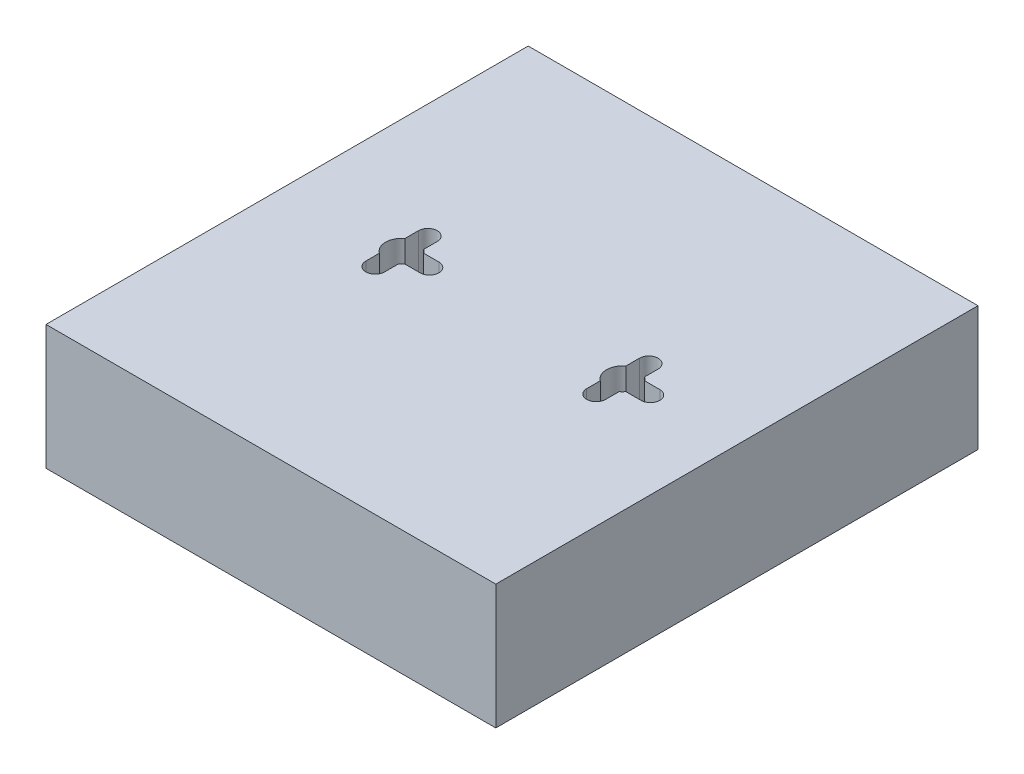
ISO-10303-21;
HEADER;
FILE_DESCRIPTION(('STEP AP214'),'2;1');
FILE_NAME('part.step','',(''),(''),'','','');
FILE_SCHEMA(('AUTOMOTIVE_DESIGN { 1 0 10303 214 1 1 1 1 }'));
ENDSEC;
DATA;
#1=APPLICATION_CONTEXT('core data for automotive mechanical design processes');
#2=APPLICATION_PROTOCOL_DEFINITION('international standard','automotive_design',2000,#1);
#3=PRODUCT_CONTEXT('',#1,'mechanical');
#4=PRODUCT('Part','Part','',(#3));
#5=PRODUCT_RELATED_PRODUCT_CATEGORY('part','',(#4));
#6=PRODUCT_DEFINITION_FORMATION('','',#4);
#7=PRODUCT_DEFINITION_CONTEXT('part definition',#1,'design');
#8=PRODUCT_DEFINITION('design','',#6,#7);
#9=PRODUCT_DEFINITION_SHAPE('','',#8);
#10=(LENGTH_UNIT() NAMED_UNIT(*) SI_UNIT(.MILLI.,.METRE.));
#11=(NAMED_UNIT(*) PLANE_ANGLE_UNIT() SI_UNIT($,.RADIAN.));
#12=(NAMED_UNIT(*) SI_UNIT($,.STERADIAN.) SOLID_ANGLE_UNIT());
#13=UNCERTAINTY_MEASURE_WITH_UNIT(LENGTH_MEASURE(1.E-05),#10,'distance_accuracy_value','');
#14=(GEOMETRIC_REPRESENTATION_CONTEXT(3) GLOBAL_UNCERTAINTY_ASSIGNED_CONTEXT((#13)) GLOBAL_UNIT_ASSIGNED_CONTEXT((#10,
#11,#12)) REPRESENTATION_CONTEXT('',''));
#15=CARTESIAN_POINT('',(0.,0.,0.));
#16=DIRECTION('',(0.,0.,1.));
#17=DIRECTION('',(1.,0.,0.));
#18=AXIS2_PLACEMENT_3D('',#15,#16,#17);
#19=CARTESIAN_POINT('',(0.,26.1,0.));
#20=DIRECTION('',(0.,0.,-1.));
#21=DIRECTION('',(-1.,0.,0.));
#22=AXIS2_PLACEMENT_3D('',#19,#20,#21);
#23=PLANE('',#22);
#24=DIRECTION('',(1.,0.,0.));
#25=VECTOR('',#24,1.);
#26=CARTESIAN_POINT('',(0.,0.,0.));
#27=LINE('',#26,#25);
#28=CARTESIAN_POINT('',(0.,0.,0.));
#29=VERTEX_POINT('',#28);
#30=CARTESIAN_POINT('',(94.2086,0.,0.));
#31=VERTEX_POINT('',#30);
#32=EDGE_CURVE('E320',#29,#31,#27,.T.);
#33=ORIENTED_EDGE('',*,*,#32,.T.);
#34=DIRECTION('',(0.,-1.,0.));
#35=VECTOR('',#34,1.);
#36=CARTESIAN_POINT('',(94.2086,26.1,0.));
#37=LINE('',#36,#35);
#38=CARTESIAN_POINT('',(94.2086,26.1,0.));
#39=VERTEX_POINT('',#38);
#40=EDGE_CURVE('E253',#39,#31,#37,.T.);
#41=ORIENTED_EDGE('',*,*,#40,.F.);
#42=DIRECTION('',(1.,0.,0.));
#43=VECTOR('',#42,1.);
#44=CARTESIAN_POINT('',(0.,26.1,0.));
#45=LINE('',#44,#43);
#46=CARTESIAN_POINT('',(0.,26.1,0.));
#47=VERTEX_POINT('',#46);
#48=EDGE_CURVE('E241',#47,#39,#45,.T.);
#49=ORIENTED_EDGE('',*,*,#48,.F.);
#50=DIRECTION('',(0.,-1.,0.));
#51=VECTOR('',#50,1.);
#52=CARTESIAN_POINT('',(0.,26.1,0.));
#53=LINE('',#52,#51);
#54=EDGE_CURVE('E56',#47,#29,#53,.T.);
#55=ORIENTED_EDGE('',*,*,#54,.T.);
#56=EDGE_LOOP('',(#33,#41,#49,#55));
#57=FACE_BOUND('',#56,.T.);
#58=ADVANCED_FACE('F32',(#57),#23,.F.);
#59=CARTESIAN_POINT('',(94.2086,26.1,0.));
#60=DIRECTION('',(-1.,0.,0.));
#61=DIRECTION('',(0.,0.,1.));
#62=AXIS2_PLACEMENT_3D('',#59,#60,#61);
#63=PLANE('',#62);
#64=DIRECTION('',(0.,0.,-1.));
#65=VECTOR('',#64,1.);
#66=CARTESIAN_POINT('',(94.2086,0.,0.));
#67=LINE('',#66,#65);
#68=CARTESIAN_POINT('',(94.2086,0.,-101.));
#69=VERTEX_POINT('',#68);
#70=EDGE_CURVE('E249',#31,#69,#67,.T.);
#71=ORIENTED_EDGE('',*,*,#70,.T.);
#72=DIRECTION('',(0.,-1.,0.));
#73=VECTOR('',#72,1.);
#74=CARTESIAN_POINT('',(94.2086,26.1,-101.));
#75=LINE('',#74,#73);
#76=CARTESIAN_POINT('',(94.2086,26.1,-101.));
#77=VERTEX_POINT('',#76);
#78=EDGE_CURVE('E247',#77,#69,#75,.T.);
#79=ORIENTED_EDGE('',*,*,#78,.F.);
#80=DIRECTION('',(0.,0.,-1.));
#81=VECTOR('',#80,1.);
#82=CARTESIAN_POINT('',(94.2086,26.1,0.));
#83=LINE('',#82,#81);
#84=EDGE_CURVE('E235',#39,#77,#83,.T.);
#85=ORIENTED_EDGE('',*,*,#84,.F.);
#86=ORIENTED_EDGE('',*,*,#40,.T.);
#87=EDGE_LOOP('',(#71,#79,#85,#86));
#88=FACE_BOUND('',#87,.T.);
#89=ADVANCED_FACE('F248',(#88),#63,.F.);
#90=CARTESIAN_POINT('',(0.,26.1,-101.));
#91=DIRECTION('',(0.,0.,-1.));
#92=DIRECTION('',(-1.,0.,0.));
#93=AXIS2_PLACEMENT_3D('',#90,#91,#92);
#94=PLANE('',#93);
#95=DIRECTION('',(0.,1.,0.));
#96=VECTOR('',#95,1.);
#97=CARTESIAN_POINT('',(6.80750174115019,21.2604929950122,-101.));
#98=LINE('',#97,#96);
#99=CARTESIAN_POINT('',(6.80750174115019,4.83950700498781,-101.));
#100=VERTEX_POINT('',#99);
#101=CARTESIAN_POINT('',(6.80750174115019,21.2604929950122,-101.));
#102=VERTEX_POINT('',#101);
#103=EDGE_CURVE('E47',#100,#102,#98,.T.);
#104=ORIENTED_EDGE('',*,*,#103,.F.);
#105=DIRECTION('',(-1.,0.,0.));
#106=VECTOR('',#105,1.);
#107=CARTESIAN_POINT('',(87.4010982588498,4.83950700498781,-101.));
#108=LINE('',#107,#106);
#109=CARTESIAN_POINT('',(87.4010982588498,4.83950700498781,-101.));
#110=VERTEX_POINT('',#109);
#111=EDGE_CURVE('E947',#110,#100,#108,.T.);
#112=ORIENTED_EDGE('',*,*,#111,.F.);
#113=DIRECTION('',(0.,-1.,0.));
#114=VECTOR('',#113,1.);
#115=CARTESIAN_POINT('',(87.4010982588498,21.2604929950122,-101.));
#116=LINE('',#115,#114);
#117=CARTESIAN_POINT('',(87.4010982588498,21.2604929950122,-101.));
#118=VERTEX_POINT('',#117);
#119=EDGE_CURVE('E951',#118,#110,#116,.T.);
#120=ORIENTED_EDGE('',*,*,#119,.F.);
#121=DIRECTION('',(1.,0.,0.));
#122=VECTOR('',#121,1.);
#123=CARTESIAN_POINT('',(87.4010982588498,21.2604929950122,-101.));
#124=LINE('',#123,#122);
#125=EDGE_CURVE('E954',#102,#118,#124,.T.);
#126=ORIENTED_EDGE('',*,*,#125,.F.);
#127=EDGE_LOOP('',(#104,#112,#120,#126));
#128=FACE_BOUND('',#127,.T.);
#129=DIRECTION('',(1.,0.,0.));
#130=VECTOR('',#129,1.);
#131=CARTESIAN_POINT('',(0.,0.,-101.));
#132=LINE('',#131,#130);
#133=CARTESIAN_POINT('',(0.,0.,-101.));
#134=VERTEX_POINT('',#133);
#135=EDGE_CURVE('E323',#134,#69,#132,.T.);
#136=ORIENTED_EDGE('',*,*,#135,.F.);
#137=DIRECTION('',(0.,-1.,0.));
#138=VECTOR('',#137,1.);
#139=CARTESIAN_POINT('',(0.,26.1,-101.));
#140=LINE('',#139,#138);
#141=CARTESIAN_POINT('',(0.,26.1,-101.));
#142=VERTEX_POINT('',#141);
#143=EDGE_CURVE('E254',#142,#134,#140,.T.);
#144=ORIENTED_EDGE('',*,*,#143,.F.);
#145=DIRECTION('',(1.,0.,0.));
#146=VECTOR('',#145,1.);
#147=CARTESIAN_POINT('',(0.,26.1,-101.));
#148=LINE('',#147,#146);
#149=EDGE_CURVE('E240',#142,#77,#148,.T.);
#150=ORIENTED_EDGE('',*,*,#149,.T.);
#151=ORIENTED_EDGE('',*,*,#78,.T.);
#152=EDGE_LOOP('',(#136,#144,#150,#151));
#153=FACE_BOUND('',#152,.T.);
#154=ADVANCED_FACE('F256',(#128,#153),#94,.T.);
#155=CARTESIAN_POINT('',(76.0948,26.1,-50.5));
#156=DIRECTION('',(0.,-1.,0.));
#157=DIRECTION('',(0.,0.,-1.));
#158=AXIS2_PLACEMENT_3D('',#155,#156,#157);
#159=CYLINDRICAL_SURFACE('',#158,1.96849999999999);
#160=CARTESIAN_POINT('',(76.0948,0.,-50.5));
#161=DIRECTION('',(0.,1.,0.));
#162=DIRECTION('',(0.,0.,1.));
#163=AXIS2_PLACEMENT_3D('',#160,#161,#162);
#164=CIRCLE('',#163,1.96849999999999);
#165=CARTESIAN_POINT('',(76.0948,0.,-48.5315));
#166=VERTEX_POINT('',#165);
#167=CARTESIAN_POINT('',(76.0948,0.,-52.4685));
#168=VERTEX_POINT('',#167);
#169=EDGE_CURVE('E292',#166,#168,#164,.T.);
#170=ORIENTED_EDGE('',*,*,#169,.F.);
#171=DIRECTION('',(0.,-1.,0.));
#172=VECTOR('',#171,1.);
#173=CARTESIAN_POINT('',(76.0948,26.1,-48.5315));
#174=LINE('',#173,#172);
#175=CARTESIAN_POINT('',(76.0948,26.1,-48.5315));
#176=VERTEX_POINT('',#175);
#177=EDGE_CURVE('E330',#176,#166,#174,.T.);
#178=ORIENTED_EDGE('',*,*,#177,.F.);
#179=CARTESIAN_POINT('',(76.0948,26.1,-50.5));
#180=DIRECTION('',(0.,1.,0.));
#181=DIRECTION('',(0.,0.,1.));
#182=AXIS2_PLACEMENT_3D('',#179,#180,#181);
#183=CIRCLE('',#182,1.96849999999999);
#184=CARTESIAN_POINT('',(76.0948,26.1,-52.4685));
#185=VERTEX_POINT('',#184);
#186=EDGE_CURVE('E527',#176,#185,#183,.T.);
#187=ORIENTED_EDGE('',*,*,#186,.T.);
#188=DIRECTION('',(0.,-1.,0.));
#189=VECTOR('',#188,1.);
#190=CARTESIAN_POINT('',(76.0948,26.1,-52.4685));
#191=LINE('',#190,#189);
#192=EDGE_CURVE('E334',#185,#168,#191,.T.);
#193=ORIENTED_EDGE('',*,*,#192,.T.);
#194=EDGE_LOOP('',(#170,#178,#187,#193));
#195=FACE_BOUND('',#194,.T.);
#196=ADVANCED_FACE('F455',(#195),#159,.F.);
#197=CARTESIAN_POINT('',(0.,26.1,-48.5315));
#198=DIRECTION('',(0.,0.,-1.));
#199=DIRECTION('',(-1.,0.,0.));
#200=AXIS2_PLACEMENT_3D('',#197,#198,#199);
#201=PLANE('',#200);
#202=DIRECTION('',(1.,0.,0.));
#203=VECTOR('',#202,1.);
#204=CARTESIAN_POINT('',(0.,0.,-48.5315));
#205=LINE('',#204,#203);
#206=CARTESIAN_POINT('',(72.9227476678834,0.,-48.5315));
#207=VERTEX_POINT('',#206);
#208=EDGE_CURVE('E295',#207,#166,#205,.T.);
#209=ORIENTED_EDGE('',*,*,#208,.F.);
#210=DIRECTION('',(0.,-1.,0.));
#211=VECTOR('',#210,1.);
#212=CARTESIAN_POINT('',(72.9227476678834,26.1,-48.5315));
#213=LINE('',#212,#211);
#214=CARTESIAN_POINT('',(72.9227476678834,26.1,-48.5315));
#215=VERTEX_POINT('',#214);
#216=EDGE_CURVE('E354',#215,#207,#213,.T.);
#217=ORIENTED_EDGE('',*,*,#216,.F.);
#218=DIRECTION('',(1.,0.,0.));
#219=VECTOR('',#218,1.);
#220=CARTESIAN_POINT('',(0.,26.1,-48.5315));
#221=LINE('',#220,#219);
#222=EDGE_CURVE('E530',#215,#176,#221,.T.);
#223=ORIENTED_EDGE('',*,*,#222,.T.);
#224=ORIENTED_EDGE('',*,*,#177,.T.);
#225=EDGE_LOOP('',(#209,#217,#223,#224));
#226=FACE_BOUND('',#225,.T.);
#227=ADVANCED_FACE('F452',(#226),#201,.T.);
#228=CARTESIAN_POINT('',(70.2401,26.1,-50.5));
#229=DIRECTION('',(0.,-1.,0.));
#230=DIRECTION('',(0.,0.,-1.));
#231=AXIS2_PLACEMENT_3D('',#228,#229,#230);
#232=CYLINDRICAL_SURFACE('',#231,3.3274);
#233=CARTESIAN_POINT('',(70.2401,0.,-50.5));
#234=DIRECTION('',(0.,1.,0.));
#235=DIRECTION('',(0.,0.,1.));
#236=AXIS2_PLACEMENT_3D('',#233,#234,#235);
#237=CIRCLE('',#236,3.3274);
#238=CARTESIAN_POINT('',(72.2086,0.,-47.8173523321167));
#239=VERTEX_POINT('',#238);
#240=EDGE_CURVE('E298',#239,#207,#237,.T.);
#241=ORIENTED_EDGE('',*,*,#240,.F.);
#242=DIRECTION('',(0.,-1.,0.));
#243=VECTOR('',#242,1.);
#244=CARTESIAN_POINT('',(72.2086,26.1,-47.8173523321167));
#245=LINE('',#244,#243);
#246=CARTESIAN_POINT('',(72.2086,26.1,-47.8173523321167));
#247=VERTEX_POINT('',#246);
#248=EDGE_CURVE('E352',#247,#239,#245,.T.);
#249=ORIENTED_EDGE('',*,*,#248,.F.);
#250=CARTESIAN_POINT('',(70.2401,26.1,-50.5));
#251=DIRECTION('',(0.,1.,0.));
#252=DIRECTION('',(0.,0.,1.));
#253=AXIS2_PLACEMENT_3D('',#250,#251,#252);
#254=CIRCLE('',#253,3.3274);
#255=EDGE_CURVE('E533',#247,#215,#254,.T.);
#256=ORIENTED_EDGE('',*,*,#255,.T.);
#257=ORIENTED_EDGE('',*,*,#216,.T.);
#258=EDGE_LOOP('',(#241,#249,#256,#257));
#259=FACE_BOUND('',#258,.T.);
#260=ADVANCED_FACE('F433',(#259),#232,.F.);
#261=CARTESIAN_POINT('',(72.2086,26.1,0.));
#262=DIRECTION('',(1.,0.,0.));
#263=DIRECTION('',(0.,0.,-1.));
#264=AXIS2_PLACEMENT_3D('',#261,#262,#263);
#265=PLANE('',#264);
#266=DIRECTION('',(0.,0.,1.));
#267=VECTOR('',#266,1.);
#268=CARTESIAN_POINT('',(72.2086,0.,0.));
#269=LINE('',#268,#267);
#270=CARTESIAN_POINT('',(72.2086,0.,-44.9882));
#271=VERTEX_POINT('',#270);
#272=EDGE_CURVE('E301',#239,#271,#269,.T.);
#273=ORIENTED_EDGE('',*,*,#272,.T.);
#274=DIRECTION('',(0.,-1.,0.));
#275=VECTOR('',#274,1.);
#276=CARTESIAN_POINT('',(72.2086,26.1,-44.9882));
#277=LINE('',#276,#275);
#278=CARTESIAN_POINT('',(72.2086,26.1,-44.9882));
#279=VERTEX_POINT('',#278);
#280=EDGE_CURVE('E350',#279,#271,#277,.T.);
#281=ORIENTED_EDGE('',*,*,#280,.F.);
#282=DIRECTION('',(0.,0.,1.));
#283=VECTOR('',#282,1.);
#284=CARTESIAN_POINT('',(72.2086,26.1,0.));
#285=LINE('',#284,#283);
#286=EDGE_CURVE('E536',#247,#279,#285,.T.);
#287=ORIENTED_EDGE('',*,*,#286,.F.);
#288=ORIENTED_EDGE('',*,*,#248,.T.);
#289=EDGE_LOOP('',(#273,#281,#287,#288));
#290=FACE_BOUND('',#289,.T.);
#291=ADVANCED_FACE('F439',(#290),#265,.F.);
#292=CARTESIAN_POINT('',(70.2401,26.1,-44.9882));
#293=DIRECTION('',(0.,-1.,0.));
#294=DIRECTION('',(0.,0.,-1.));
#295=AXIS2_PLACEMENT_3D('',#292,#293,#294);
#296=CYLINDRICAL_SURFACE('',#295,1.96850000000003);
#297=CARTESIAN_POINT('',(70.2401,0.,-44.9882));
#298=DIRECTION('',(0.,1.,0.));
#299=DIRECTION('',(0.,0.,1.));
#300=AXIS2_PLACEMENT_3D('',#297,#298,#299);
#301=CIRCLE('',#300,1.96850000000003);
#302=CARTESIAN_POINT('',(68.2716,0.,-44.9882));
#303=VERTEX_POINT('',#302);
#304=EDGE_CURVE('E306',#303,#271,#301,.T.);
#305=ORIENTED_EDGE('',*,*,#304,.F.);
#306=DIRECTION('',(0.,-1.,0.));
#307=VECTOR('',#306,1.);
#308=CARTESIAN_POINT('',(68.2716,26.1,-44.9882));
#309=LINE('',#308,#307);
#310=CARTESIAN_POINT('',(68.2716,26.1,-44.9882));
#311=VERTEX_POINT('',#310);
#312=EDGE_CURVE('E348',#311,#303,#309,.T.);
#313=ORIENTED_EDGE('',*,*,#312,.F.);
#314=CARTESIAN_POINT('',(70.2401,26.1,-44.9882));
#315=DIRECTION('',(0.,1.,0.));
#316=DIRECTION('',(0.,0.,1.));
#317=AXIS2_PLACEMENT_3D('',#314,#315,#316);
#318=CIRCLE('',#317,1.96850000000003);
#319=EDGE_CURVE('E540',#311,#279,#318,.T.);
#320=ORIENTED_EDGE('',*,*,#319,.T.);
#321=ORIENTED_EDGE('',*,*,#280,.T.);
#322=EDGE_LOOP('',(#305,#313,#320,#321));
#323=FACE_BOUND('',#322,.T.);
#324=ADVANCED_FACE('F448',(#323),#296,.F.);
#325=CARTESIAN_POINT('',(68.2716,26.1,0.));
#326=DIRECTION('',(1.,0.,0.));
#327=DIRECTION('',(0.,0.,-1.));
#328=AXIS2_PLACEMENT_3D('',#325,#326,#327);
#329=PLANE('',#328);
#330=DIRECTION('',(0.,0.,1.));
#331=VECTOR('',#330,1.);
#332=CARTESIAN_POINT('',(68.2716,0.,0.));
#333=LINE('',#332,#331);
#334=CARTESIAN_POINT('',(68.2716,0.,-47.8173523321167));
#335=VERTEX_POINT('',#334);
#336=EDGE_CURVE('E310',#335,#303,#333,.T.);
#337=ORIENTED_EDGE('',*,*,#336,.F.);
#338=DIRECTION('',(0.,-1.,0.));
#339=VECTOR('',#338,1.);
#340=CARTESIAN_POINT('',(68.2716,26.1,-47.8173523321167));
#341=LINE('',#340,#339);
#342=CARTESIAN_POINT('',(68.2716,26.1,-47.8173523321167));
#343=VERTEX_POINT('',#342);
#344=EDGE_CURVE('E346',#343,#335,#341,.T.);
#345=ORIENTED_EDGE('',*,*,#344,.F.);
#346=DIRECTION('',(0.,0.,1.));
#347=VECTOR('',#346,1.);
#348=CARTESIAN_POINT('',(68.2716,26.1,0.));
#349=LINE('',#348,#347);
#350=EDGE_CURVE('E544',#343,#311,#349,.T.);
#351=ORIENTED_EDGE('',*,*,#350,.T.);
#352=ORIENTED_EDGE('',*,*,#312,.T.);
#353=EDGE_LOOP('',(#337,#345,#351,#352));
#354=FACE_BOUND('',#353,.T.);
#355=ADVANCED_FACE('F447',(#354),#329,.T.);
#356=CARTESIAN_POINT('',(68.2716,0.,-53.1826476678833));
#357=VERTEX_POINT('',#356);
#358=EDGE_CURVE('E303',#357,#335,#237,.T.);
#359=ORIENTED_EDGE('',*,*,#358,.F.);
#360=DIRECTION('',(0.,-1.,0.));
#361=VECTOR('',#360,1.);
#362=CARTESIAN_POINT('',(68.2716,26.1,-53.1826476678833));
#363=LINE('',#362,#361);
#364=CARTESIAN_POINT('',(68.2716,26.1,-53.1826476678833));
#365=VERTEX_POINT('',#364);
#366=EDGE_CURVE('E344',#365,#357,#363,.T.);
#367=ORIENTED_EDGE('',*,*,#366,.F.);
#368=EDGE_CURVE('E538',#365,#343,#254,.T.);
#369=ORIENTED_EDGE('',*,*,#368,.T.);
#370=ORIENTED_EDGE('',*,*,#344,.T.);
#371=EDGE_LOOP('',(#359,#367,#369,#370));
#372=FACE_BOUND('',#371,.T.);
#373=ADVANCED_FACE('F434',(#372),#232,.F.);
#374=CARTESIAN_POINT('',(68.2716,0.,-56.0118));
#375=VERTEX_POINT('',#374);
#376=EDGE_CURVE('E313',#375,#357,#333,.T.);
#377=ORIENTED_EDGE('',*,*,#376,.F.);
#378=DIRECTION('',(0.,-1.,0.));
#379=VECTOR('',#378,1.);
#380=CARTESIAN_POINT('',(68.2716,26.1,-56.0118));
#381=LINE('',#380,#379);
#382=CARTESIAN_POINT('',(68.2716,26.1,-56.0118));
#383=VERTEX_POINT('',#382);
#384=EDGE_CURVE('E342',#383,#375,#381,.T.);
#385=ORIENTED_EDGE('',*,*,#384,.F.);
#386=EDGE_CURVE('E547',#383,#365,#349,.T.);
#387=ORIENTED_EDGE('',*,*,#386,.T.);
#388=ORIENTED_EDGE('',*,*,#366,.T.);
#389=EDGE_LOOP('',(#377,#385,#387,#388));
#390=FACE_BOUND('',#389,.T.);
#391=ADVANCED_FACE('F442',(#390),#329,.T.);
#392=CARTESIAN_POINT('',(70.2401,26.1,-56.0118));
#393=DIRECTION('',(0.,-1.,0.));
#394=DIRECTION('',(0.,0.,-1.));
#395=AXIS2_PLACEMENT_3D('',#392,#393,#394);
#396=CYLINDRICAL_SURFACE('',#395,1.96850000000003);
#397=CARTESIAN_POINT('',(70.2401,0.,-56.0118));
#398=DIRECTION('',(0.,1.,0.));
#399=DIRECTION('',(0.,0.,1.));
#400=AXIS2_PLACEMENT_3D('',#397,#398,#399);
#401=CIRCLE('',#400,1.96850000000003);
#402=CARTESIAN_POINT('',(72.2086,0.,-56.0118));
#403=VERTEX_POINT('',#402);
#404=EDGE_CURVE('E314',#403,#375,#401,.T.);
#405=ORIENTED_EDGE('',*,*,#404,.F.);
#406=DIRECTION('',(0.,-1.,0.));
#407=VECTOR('',#406,1.);
#408=CARTESIAN_POINT('',(72.2086,26.1,-56.0118));
#409=LINE('',#408,#407);
#410=CARTESIAN_POINT('',(72.2086,26.1,-56.0118));
#411=VERTEX_POINT('',#410);
#412=EDGE_CURVE('E340',#411,#403,#409,.T.);
#413=ORIENTED_EDGE('',*,*,#412,.F.);
#414=CARTESIAN_POINT('',(70.2401,26.1,-56.0118));
#415=DIRECTION('',(0.,1.,0.));
#416=DIRECTION('',(0.,0.,1.));
#417=AXIS2_PLACEMENT_3D('',#414,#415,#416);
#418=CIRCLE('',#417,1.96850000000003);
#419=EDGE_CURVE('E548',#411,#383,#418,.T.);
#420=ORIENTED_EDGE('',*,*,#419,.T.);
#421=ORIENTED_EDGE('',*,*,#384,.T.);
#422=EDGE_LOOP('',(#405,#413,#420,#421));
#423=FACE_BOUND('',#422,.T.);
#424=ADVANCED_FACE('F437',(#423),#396,.F.);
#425=CARTESIAN_POINT('',(72.2086,0.,-53.1826476678833));
#426=VERTEX_POINT('',#425);
#427=EDGE_CURVE('E307',#403,#426,#269,.T.);
#428=ORIENTED_EDGE('',*,*,#427,.T.);
#429=DIRECTION('',(0.,-1.,0.));
#430=VECTOR('',#429,1.);
#431=CARTESIAN_POINT('',(72.2086,26.1,-53.1826476678833));
#432=LINE('',#431,#430);
#433=CARTESIAN_POINT('',(72.2086,26.1,-53.1826476678833));
#434=VERTEX_POINT('',#433);
#435=EDGE_CURVE('E338',#434,#426,#432,.T.);
#436=ORIENTED_EDGE('',*,*,#435,.F.);
#437=EDGE_CURVE('E541',#411,#434,#285,.T.);
#438=ORIENTED_EDGE('',*,*,#437,.F.);
#439=ORIENTED_EDGE('',*,*,#412,.T.);
#440=EDGE_LOOP('',(#428,#436,#438,#439));
#441=FACE_BOUND('',#440,.T.);
#442=ADVANCED_FACE('F431',(#441),#265,.F.);
#443=CARTESIAN_POINT('',(72.9227476678834,0.,-52.4685));
#444=VERTEX_POINT('',#443);
#445=EDGE_CURVE('E302',#444,#426,#237,.T.);
#446=ORIENTED_EDGE('',*,*,#445,.F.);
#447=DIRECTION('',(0.,-1.,0.));
#448=VECTOR('',#447,1.);
#449=CARTESIAN_POINT('',(72.9227476678834,26.1,-52.4685));
#450=LINE('',#449,#448);
#451=CARTESIAN_POINT('',(72.9227476678834,26.1,-52.4685));
#452=VERTEX_POINT('',#451);
#453=EDGE_CURVE('E336',#452,#444,#450,.T.);
#454=ORIENTED_EDGE('',*,*,#453,.F.);
#455=EDGE_CURVE('E537',#452,#434,#254,.T.);
#456=ORIENTED_EDGE('',*,*,#455,.T.);
#457=ORIENTED_EDGE('',*,*,#435,.T.);
#458=EDGE_LOOP('',(#446,#454,#456,#457));
#459=FACE_BOUND('',#458,.T.);
#460=ADVANCED_FACE('F428',(#459),#232,.F.);
#461=CARTESIAN_POINT('',(29.8232,26.1,-50.5));
#462=DIRECTION('',(0.,-1.,0.));
#463=DIRECTION('',(0.,0.,-1.));
#464=AXIS2_PLACEMENT_3D('',#461,#462,#463);
#465=CYLINDRICAL_SURFACE('',#464,1.9685);
#466=CARTESIAN_POINT('',(29.8232,0.,-50.5));
#467=DIRECTION('',(0.,1.,0.));
#468=DIRECTION('',(0.,0.,1.));
#469=AXIS2_PLACEMENT_3D('',#466,#467,#468);
#470=CIRCLE('',#469,1.9685);
#471=CARTESIAN_POINT('',(29.8232,0.,-48.5315));
#472=VERTEX_POINT('',#471);
#473=CARTESIAN_POINT('',(29.8232,0.,-52.4685));
#474=VERTEX_POINT('',#473);
#475=EDGE_CURVE('E263',#472,#474,#470,.T.);
#476=ORIENTED_EDGE('',*,*,#475,.F.);
#477=DIRECTION('',(0.,-1.,0.));
#478=VECTOR('',#477,1.);
#479=CARTESIAN_POINT('',(29.8232,26.1,-48.5315));
#480=LINE('',#479,#478);
#481=CARTESIAN_POINT('',(29.8232,26.1,-48.5315));
#482=VERTEX_POINT('',#481);
#483=EDGE_CURVE('E155',#482,#472,#480,.T.);
#484=ORIENTED_EDGE('',*,*,#483,.F.);
#485=CARTESIAN_POINT('',(29.8232,26.1,-50.5));
#486=DIRECTION('',(0.,1.,0.));
#487=DIRECTION('',(0.,0.,1.));
#488=AXIS2_PLACEMENT_3D('',#485,#486,#487);
#489=CIRCLE('',#488,1.9685);
#490=CARTESIAN_POINT('',(29.8232,26.1,-52.4685));
#491=VERTEX_POINT('',#490);
#492=EDGE_CURVE('E328',#482,#491,#489,.T.);
#493=ORIENTED_EDGE('',*,*,#492,.T.);
#494=DIRECTION('',(0.,-1.,0.));
#495=VECTOR('',#494,1.);
#496=CARTESIAN_POINT('',(29.8232,26.1,-52.4685));
#497=LINE('',#496,#495);
#498=EDGE_CURVE('E259',#491,#474,#497,.T.);
#499=ORIENTED_EDGE('',*,*,#498,.T.);
#500=EDGE_LOOP('',(#476,#484,#493,#499));
#501=FACE_BOUND('',#500,.T.);
#502=ADVANCED_FACE('F34',(#501),#465,.F.);
#503=CARTESIAN_POINT('',(0.,26.1,-48.5315));
#504=DIRECTION('',(0.,0.,-1.));
#505=DIRECTION('',(-1.,0.,0.));
#506=AXIS2_PLACEMENT_3D('',#503,#504,#505);
#507=PLANE('',#506);
#508=DIRECTION('',(1.,0.,0.));
#509=VECTOR('',#508,1.);
#510=CARTESIAN_POINT('',(0.,0.,-48.5315));
#511=LINE('',#510,#509);
#512=CARTESIAN_POINT('',(26.6511476678834,0.,-48.5315));
#513=VERTEX_POINT('',#512);
#514=EDGE_CURVE('E266',#513,#472,#511,.T.);
#515=ORIENTED_EDGE('',*,*,#514,.F.);
#516=DIRECTION('',(0.,-1.,0.));
#517=VECTOR('',#516,1.);
#518=CARTESIAN_POINT('',(26.6511476678834,26.1,-48.5315));
#519=LINE('',#518,#517);
#520=CARTESIAN_POINT('',(26.6511476678834,26.1,-48.5315));
#521=VERTEX_POINT('',#520);
#522=EDGE_CURVE('E376',#521,#513,#519,.T.);
#523=ORIENTED_EDGE('',*,*,#522,.F.);
#524=DIRECTION('',(1.,0.,0.));
#525=VECTOR('',#524,1.);
#526=CARTESIAN_POINT('',(0.,26.1,-48.5315));
#527=LINE('',#526,#525);
#528=EDGE_CURVE('E500',#521,#482,#527,.T.);
#529=ORIENTED_EDGE('',*,*,#528,.T.);
#530=ORIENTED_EDGE('',*,*,#483,.T.);
#531=EDGE_LOOP('',(#515,#523,#529,#530));
#532=FACE_BOUND('',#531,.T.);
#533=ADVANCED_FACE('F482',(#532),#507,.T.);
#534=CARTESIAN_POINT('',(23.9685,26.1,-50.5));
#535=DIRECTION('',(0.,-1.,0.));
#536=DIRECTION('',(0.,0.,-1.));
#537=AXIS2_PLACEMENT_3D('',#534,#535,#536);
#538=CYLINDRICAL_SURFACE('',#537,3.32740000000001);
#539=CARTESIAN_POINT('',(23.9685,0.,-50.5));
#540=DIRECTION('',(0.,1.,0.));
#541=DIRECTION('',(0.,0.,1.));
#542=AXIS2_PLACEMENT_3D('',#539,#540,#541);
#543=CIRCLE('',#542,3.32740000000001);
#544=CARTESIAN_POINT('',(25.937,0.,-47.8173523321166));
#545=VERTEX_POINT('',#544);
#546=EDGE_CURVE('E270',#545,#513,#543,.T.);
#547=ORIENTED_EDGE('',*,*,#546,.F.);
#548=DIRECTION('',(0.,-1.,0.));
#549=VECTOR('',#548,1.);
#550=CARTESIAN_POINT('',(25.937,26.1,-47.8173523321166));
#551=LINE('',#550,#549);
#552=CARTESIAN_POINT('',(25.937,26.1,-47.8173523321166));
#553=VERTEX_POINT('',#552);
#554=EDGE_CURVE('E374',#553,#545,#551,.T.);
#555=ORIENTED_EDGE('',*,*,#554,.F.);
#556=CARTESIAN_POINT('',(23.9685,26.1,-50.5));
#557=DIRECTION('',(0.,1.,0.));
#558=DIRECTION('',(0.,0.,1.));
#559=AXIS2_PLACEMENT_3D('',#556,#557,#558);
#560=CIRCLE('',#559,3.32740000000001);
#561=EDGE_CURVE('E498',#553,#521,#560,.T.);
#562=ORIENTED_EDGE('',*,*,#561,.T.);
#563=ORIENTED_EDGE('',*,*,#522,.T.);
#564=EDGE_LOOP('',(#547,#555,#562,#563));
#565=FACE_BOUND('',#564,.T.);
#566=ADVANCED_FACE('F464',(#565),#538,.F.);
#567=CARTESIAN_POINT('',(25.937,26.1,0.));
#568=DIRECTION('',(1.,0.,0.));
#569=DIRECTION('',(0.,0.,-1.));
#570=AXIS2_PLACEMENT_3D('',#567,#568,#569);
#571=PLANE('',#570);
#572=DIRECTION('',(0.,0.,1.));
#573=VECTOR('',#572,1.);
#574=CARTESIAN_POINT('',(25.937,0.,0.));
#575=LINE('',#574,#573);
#576=CARTESIAN_POINT('',(25.937,0.,-44.9882));
#577=VERTEX_POINT('',#576);
#578=EDGE_CURVE('E273',#545,#577,#575,.T.);
#579=ORIENTED_EDGE('',*,*,#578,.T.);
#580=DIRECTION('',(0.,-1.,0.));
#581=VECTOR('',#580,1.);
#582=CARTESIAN_POINT('',(25.937,26.1,-44.9882));
#583=LINE('',#582,#581);
#584=CARTESIAN_POINT('',(25.937,26.1,-44.9882));
#585=VERTEX_POINT('',#584);
#586=EDGE_CURVE('E372',#585,#577,#583,.T.);
#587=ORIENTED_EDGE('',*,*,#586,.F.);
#588=DIRECTION('',(0.,0.,1.));
#589=VECTOR('',#588,1.);
#590=CARTESIAN_POINT('',(25.937,26.1,0.));
#591=LINE('',#590,#589);
#592=EDGE_CURVE('E499',#553,#585,#591,.T.);
#593=ORIENTED_EDGE('',*,*,#592,.F.);
#594=ORIENTED_EDGE('',*,*,#554,.T.);
#595=EDGE_LOOP('',(#579,#587,#593,#594));
#596=FACE_BOUND('',#595,.T.);
#597=ADVANCED_FACE('F470',(#596),#571,.F.);
#598=CARTESIAN_POINT('',(23.9685,26.1,-44.9882));
#599=DIRECTION('',(0.,-1.,0.));
#600=DIRECTION('',(0.,0.,-1.));
#601=AXIS2_PLACEMENT_3D('',#598,#599,#600);
#602=CYLINDRICAL_SURFACE('',#601,1.9685);
#603=CARTESIAN_POINT('',(23.9685,0.,-44.9882));
#604=DIRECTION('',(0.,1.,0.));
#605=DIRECTION('',(0.,0.,1.));
#606=AXIS2_PLACEMENT_3D('',#603,#604,#605);
#607=CIRCLE('',#606,1.9685);
#608=CARTESIAN_POINT('',(22.,0.,-44.9882));
#609=VERTEX_POINT('',#608);
#610=EDGE_CURVE('E278',#609,#577,#607,.T.);
#611=ORIENTED_EDGE('',*,*,#610,.F.);
#612=DIRECTION('',(0.,-1.,0.));
#613=VECTOR('',#612,1.);
#614=CARTESIAN_POINT('',(22.,26.1,-44.9882));
#615=LINE('',#614,#613);
#616=CARTESIAN_POINT('',(22.,26.1,-44.9882));
#617=VERTEX_POINT('',#616);
#618=EDGE_CURVE('E370',#617,#609,#615,.T.);
#619=ORIENTED_EDGE('',*,*,#618,.F.);
#620=CARTESIAN_POINT('',(23.9685,26.1,-44.9882));
#621=DIRECTION('',(0.,1.,0.));
#622=DIRECTION('',(0.,0.,1.));
#623=AXIS2_PLACEMENT_3D('',#620,#621,#622);
#624=CIRCLE('',#623,1.9685);
#625=EDGE_CURVE('E504',#617,#585,#624,.T.);
#626=ORIENTED_EDGE('',*,*,#625,.T.);
#627=ORIENTED_EDGE('',*,*,#586,.T.);
#628=EDGE_LOOP('',(#611,#619,#626,#627));
#629=FACE_BOUND('',#628,.T.);
#630=ADVANCED_FACE('F479',(#629),#602,.F.);
#631=CARTESIAN_POINT('',(22.,26.1,0.));
#632=DIRECTION('',(1.,0.,0.));
#633=DIRECTION('',(0.,0.,-1.));
#634=AXIS2_PLACEMENT_3D('',#631,#632,#633);
#635=PLANE('',#634);
#636=DIRECTION('',(0.,0.,1.));
#637=VECTOR('',#636,1.);
#638=CARTESIAN_POINT('',(22.,0.,0.));
#639=LINE('',#638,#637);
#640=CARTESIAN_POINT('',(22.,0.,-47.8173523321166));
#641=VERTEX_POINT('',#640);
#642=EDGE_CURVE('E282',#641,#609,#639,.T.);
#643=ORIENTED_EDGE('',*,*,#642,.F.);
#644=DIRECTION('',(0.,-1.,0.));
#645=VECTOR('',#644,1.);
#646=CARTESIAN_POINT('',(22.,26.1,-47.8173523321166));
#647=LINE('',#646,#645);
#648=CARTESIAN_POINT('',(22.,26.1,-47.8173523321166));
#649=VERTEX_POINT('',#648);
#650=EDGE_CURVE('E368',#649,#641,#647,.T.);
#651=ORIENTED_EDGE('',*,*,#650,.F.);
#652=DIRECTION('',(0.,0.,1.));
#653=VECTOR('',#652,1.);
#654=CARTESIAN_POINT('',(22.,26.1,0.));
#655=LINE('',#654,#653);
#656=EDGE_CURVE('E512',#649,#617,#655,.T.);
#657=ORIENTED_EDGE('',*,*,#656,.T.);
#658=ORIENTED_EDGE('',*,*,#618,.T.);
#659=EDGE_LOOP('',(#643,#651,#657,#658));
#660=FACE_BOUND('',#659,.T.);
#661=ADVANCED_FACE('F478',(#660),#635,.T.);
#662=CARTESIAN_POINT('',(22.,0.,-53.1826476678834));
#663=VERTEX_POINT('',#662);
#664=EDGE_CURVE('E275',#663,#641,#543,.T.);
#665=ORIENTED_EDGE('',*,*,#664,.F.);
#666=DIRECTION('',(0.,-1.,0.));
#667=VECTOR('',#666,1.);
#668=CARTESIAN_POINT('',(22.,26.1,-53.1826476678834));
#669=LINE('',#668,#667);
#670=CARTESIAN_POINT('',(22.,26.1,-53.1826476678834));
#671=VERTEX_POINT('',#670);
#672=EDGE_CURVE('E366',#671,#663,#669,.T.);
#673=ORIENTED_EDGE('',*,*,#672,.F.);
#674=EDGE_CURVE('E503',#671,#649,#560,.T.);
#675=ORIENTED_EDGE('',*,*,#674,.T.);
#676=ORIENTED_EDGE('',*,*,#650,.T.);
#677=EDGE_LOOP('',(#665,#673,#675,#676));
#678=FACE_BOUND('',#677,.T.);
#679=ADVANCED_FACE('F465',(#678),#538,.F.);
#680=CARTESIAN_POINT('',(22.,0.,-56.0118));
#681=VERTEX_POINT('',#680);
#682=EDGE_CURVE('E285',#681,#663,#639,.T.);
#683=ORIENTED_EDGE('',*,*,#682,.F.);
#684=DIRECTION('',(0.,-1.,0.));
#685=VECTOR('',#684,1.);
#686=CARTESIAN_POINT('',(22.,26.1,-56.0118));
#687=LINE('',#686,#685);
#688=CARTESIAN_POINT('',(22.,26.1,-56.0118));
#689=VERTEX_POINT('',#688);
#690=EDGE_CURVE('E364',#689,#681,#687,.T.);
#691=ORIENTED_EDGE('',*,*,#690,.F.);
#692=EDGE_CURVE('E511',#689,#671,#655,.T.);
#693=ORIENTED_EDGE('',*,*,#692,.T.);
#694=ORIENTED_EDGE('',*,*,#672,.T.);
#695=EDGE_LOOP('',(#683,#691,#693,#694));
#696=FACE_BOUND('',#695,.T.);
#697=ADVANCED_FACE('F473',(#696),#635,.T.);
#698=CARTESIAN_POINT('',(23.9685,26.1,-56.0118));
#699=DIRECTION('',(0.,-1.,0.));
#700=DIRECTION('',(0.,0.,-1.));
#701=AXIS2_PLACEMENT_3D('',#698,#699,#700);
#702=CYLINDRICAL_SURFACE('',#701,1.9685);
#703=CARTESIAN_POINT('',(23.9685,0.,-56.0118));
#704=DIRECTION('',(0.,1.,0.));
#705=DIRECTION('',(0.,0.,1.));
#706=AXIS2_PLACEMENT_3D('',#703,#704,#705);
#707=CIRCLE('',#706,1.9685);
#708=CARTESIAN_POINT('',(25.937,0.,-56.0118));
#709=VERTEX_POINT('',#708);
#710=EDGE_CURVE('E286',#709,#681,#707,.T.);
#711=ORIENTED_EDGE('',*,*,#710,.F.);
#712=DIRECTION('',(0.,-1.,0.));
#713=VECTOR('',#712,1.);
#714=CARTESIAN_POINT('',(25.937,26.1,-56.0118));
#715=LINE('',#714,#713);
#716=CARTESIAN_POINT('',(25.937,26.1,-56.0118));
#717=VERTEX_POINT('',#716);
#718=EDGE_CURVE('E362',#717,#709,#715,.T.);
#719=ORIENTED_EDGE('',*,*,#718,.F.);
#720=CARTESIAN_POINT('',(23.9685,26.1,-56.0118));
#721=DIRECTION('',(0.,1.,0.));
#722=DIRECTION('',(0.,0.,1.));
#723=AXIS2_PLACEMENT_3D('',#720,#721,#722);
#724=CIRCLE('',#723,1.9685);
#725=EDGE_CURVE('E516',#717,#689,#724,.T.);
#726=ORIENTED_EDGE('',*,*,#725,.T.);
#727=ORIENTED_EDGE('',*,*,#690,.T.);
#728=EDGE_LOOP('',(#711,#719,#726,#727));
#729=FACE_BOUND('',#728,.T.);
#730=ADVANCED_FACE('F468',(#729),#702,.F.);
#731=CARTESIAN_POINT('',(25.937,0.,-53.1826476678834));
#732=VERTEX_POINT('',#731);
#733=EDGE_CURVE('E279',#709,#732,#575,.T.);
#734=ORIENTED_EDGE('',*,*,#733,.T.);
#735=DIRECTION('',(0.,-1.,0.));
#736=VECTOR('',#735,1.);
#737=CARTESIAN_POINT('',(25.937,26.1,-53.1826476678834));
#738=LINE('',#737,#736);
#739=CARTESIAN_POINT('',(25.937,26.1,-53.1826476678834));
#740=VERTEX_POINT('',#739);
#741=EDGE_CURVE('E360',#740,#732,#738,.T.);
#742=ORIENTED_EDGE('',*,*,#741,.F.);
#743=EDGE_CURVE('E506',#717,#740,#591,.T.);
#744=ORIENTED_EDGE('',*,*,#743,.F.);
#745=ORIENTED_EDGE('',*,*,#718,.T.);
#746=EDGE_LOOP('',(#734,#742,#744,#745));
#747=FACE_BOUND('',#746,.T.);
#748=ADVANCED_FACE('F462',(#747),#571,.F.);
#749=CARTESIAN_POINT('',(26.6511476678834,0.,-52.4685));
#750=VERTEX_POINT('',#749);
#751=EDGE_CURVE('E274',#750,#732,#543,.T.);
#752=ORIENTED_EDGE('',*,*,#751,.F.);
#753=DIRECTION('',(0.,-1.,0.));
#754=VECTOR('',#753,1.);
#755=CARTESIAN_POINT('',(26.6511476678834,26.1,-52.4685));
#756=LINE('',#755,#754);
#757=CARTESIAN_POINT('',(26.6511476678834,26.1,-52.4685));
#758=VERTEX_POINT('',#757);
#759=EDGE_CURVE('E358',#758,#750,#756,.T.);
#760=ORIENTED_EDGE('',*,*,#759,.F.);
#761=EDGE_CURVE('E502',#758,#740,#560,.T.);
#762=ORIENTED_EDGE('',*,*,#761,.T.);
#763=ORIENTED_EDGE('',*,*,#741,.T.);
#764=EDGE_LOOP('',(#752,#760,#762,#763));
#765=FACE_BOUND('',#764,.T.);
#766=ADVANCED_FACE('F426',(#765),#538,.F.);
#767=CARTESIAN_POINT('',(0.,26.1,-52.4685));
#768=DIRECTION('',(0.,0.,-1.));
#769=DIRECTION('',(-1.,0.,0.));
#770=AXIS2_PLACEMENT_3D('',#767,#768,#769);
#771=PLANE('',#770);
#772=DIRECTION('',(1.,0.,0.));
#773=VECTOR('',#772,1.);
#774=CARTESIAN_POINT('',(0.,0.,-52.4685));
#775=LINE('',#774,#773);
#776=EDGE_CURVE('E317',#444,#168,#775,.T.);
#777=ORIENTED_EDGE('',*,*,#776,.T.);
#778=ORIENTED_EDGE('',*,*,#192,.F.);
#779=DIRECTION('',(1.,0.,0.));
#780=VECTOR('',#779,1.);
#781=CARTESIAN_POINT('',(0.,26.1,-52.4685));
#782=LINE('',#781,#780);
#783=EDGE_CURVE('E551',#452,#185,#782,.T.);
#784=ORIENTED_EDGE('',*,*,#783,.F.);
#785=ORIENTED_EDGE('',*,*,#453,.T.);
#786=EDGE_LOOP('',(#777,#778,#784,#785));
#787=FACE_BOUND('',#786,.T.);
#788=ADVANCED_FACE('F413',(#787),#771,.F.);
#789=CARTESIAN_POINT('',(0.,26.1,-52.4685));
#790=DIRECTION('',(0.,0.,-1.));
#791=DIRECTION('',(-1.,0.,0.));
#792=AXIS2_PLACEMENT_3D('',#789,#790,#791);
#793=PLANE('',#792);
#794=DIRECTION('',(1.,0.,0.));
#795=VECTOR('',#794,1.);
#796=CARTESIAN_POINT('',(0.,0.,-52.4685));
#797=LINE('',#796,#795);
#798=EDGE_CURVE('E289',#750,#474,#797,.T.);
#799=ORIENTED_EDGE('',*,*,#798,.T.);
#800=ORIENTED_EDGE('',*,*,#498,.F.);
#801=DIRECTION('',(1.,0.,0.));
#802=VECTOR('',#801,1.);
#803=CARTESIAN_POINT('',(0.,26.1,-52.4685));
#804=LINE('',#803,#802);
#805=EDGE_CURVE('E509',#758,#491,#804,.T.);
#806=ORIENTED_EDGE('',*,*,#805,.F.);
#807=ORIENTED_EDGE('',*,*,#759,.T.);
#808=EDGE_LOOP('',(#799,#800,#806,#807));
#809=FACE_BOUND('',#808,.T.);
#810=ADVANCED_FACE('F405',(#809),#793,.F.);
#811=CARTESIAN_POINT('',(0.,26.1,0.));
#812=DIRECTION('',(-1.,0.,0.));
#813=DIRECTION('',(0.,0.,1.));
#814=AXIS2_PLACEMENT_3D('',#811,#812,#813);
#815=PLANE('',#814);
#816=DIRECTION('',(0.,0.,-1.));
#817=VECTOR('',#816,1.);
#818=CARTESIAN_POINT('',(0.,0.,0.));
#819=LINE('',#818,#817);
#820=EDGE_CURVE('E325',#29,#134,#819,.T.);
#821=ORIENTED_EDGE('',*,*,#820,.F.);
#822=ORIENTED_EDGE('',*,*,#54,.F.);
#823=DIRECTION('',(0.,0.,-1.));
#824=VECTOR('',#823,1.);
#825=CARTESIAN_POINT('',(0.,26.1,0.));
#826=LINE('',#825,#824);
#827=EDGE_CURVE('E257',#47,#142,#826,.T.);
#828=ORIENTED_EDGE('',*,*,#827,.T.);
#829=ORIENTED_EDGE('',*,*,#143,.T.);
#830=EDGE_LOOP('',(#821,#822,#828,#829));
#831=FACE_BOUND('',#830,.T.);
#832=ADVANCED_FACE('F403',(#831),#815,.T.);
#833=CARTESIAN_POINT('',(0.,26.1,0.));
#834=DIRECTION('',(0.,1.,0.));
#835=DIRECTION('',(0.,0.,1.));
#836=AXIS2_PLACEMENT_3D('',#833,#834,#835);
#837=PLANE('',#836);
#838=ORIENTED_EDGE('',*,*,#492,.F.);
#839=ORIENTED_EDGE('',*,*,#528,.F.);
#840=ORIENTED_EDGE('',*,*,#561,.F.);
#841=ORIENTED_EDGE('',*,*,#592,.T.);
#842=ORIENTED_EDGE('',*,*,#625,.F.);
#843=ORIENTED_EDGE('',*,*,#656,.F.);
#844=ORIENTED_EDGE('',*,*,#674,.F.);
#845=ORIENTED_EDGE('',*,*,#692,.F.);
#846=ORIENTED_EDGE('',*,*,#725,.F.);
#847=ORIENTED_EDGE('',*,*,#743,.T.);
#848=ORIENTED_EDGE('',*,*,#761,.F.);
#849=ORIENTED_EDGE('',*,*,#805,.T.);
#850=EDGE_LOOP('',(#838,#839,#840,#841,#842,#843,#844,#845,#846,#847,#848,#849));
#851=FACE_BOUND('',#850,.T.);
#852=ORIENTED_EDGE('',*,*,#186,.F.);
#853=ORIENTED_EDGE('',*,*,#222,.F.);
#854=ORIENTED_EDGE('',*,*,#255,.F.);
#855=ORIENTED_EDGE('',*,*,#286,.T.);
#856=ORIENTED_EDGE('',*,*,#319,.F.);
#857=ORIENTED_EDGE('',*,*,#350,.F.);
#858=ORIENTED_EDGE('',*,*,#368,.F.);
#859=ORIENTED_EDGE('',*,*,#386,.F.);
#860=ORIENTED_EDGE('',*,*,#419,.F.);
#861=ORIENTED_EDGE('',*,*,#437,.T.);
#862=ORIENTED_EDGE('',*,*,#455,.F.);
#863=ORIENTED_EDGE('',*,*,#783,.T.);
#864=EDGE_LOOP('',(#852,#853,#854,#855,#856,#857,#858,#859,#860,#861,#862,#863));
#865=FACE_BOUND('',#864,.T.);
#866=ORIENTED_EDGE('',*,*,#48,.T.);
#867=ORIENTED_EDGE('',*,*,#84,.T.);
#868=ORIENTED_EDGE('',*,*,#149,.F.);
#869=ORIENTED_EDGE('',*,*,#827,.F.);
#870=EDGE_LOOP('',(#866,#867,#868,#869));
#871=FACE_BOUND('',#870,.T.);
#872=ADVANCED_FACE('F237',(#851,#865,#871),#837,.T.);
#873=CARTESIAN_POINT('',(0.,0.,0.));
#874=DIRECTION('',(0.,1.,0.));
#875=DIRECTION('',(0.,0.,1.));
#876=AXIS2_PLACEMENT_3D('',#873,#874,#875);
#877=PLANE('',#876);
#878=CARTESIAN_POINT('',(82.2706,0.,-85.76));
#879=DIRECTION('',(0.,1.,0.));
#880=DIRECTION('',(0.,0.,1.));
#881=AXIS2_PLACEMENT_3D('',#878,#879,#880);
#882=CIRCLE('',#881,5.46099999999999);
#883=CARTESIAN_POINT('',(82.2706,0.,-80.299));
#884=VERTEX_POINT('',#883);
#885=EDGE_CURVE('E11',#884,#884,#882,.F.);
#886=ORIENTED_EDGE('',*,*,#885,.F.);
#887=EDGE_LOOP('',(#886));
#888=FACE_BOUND('',#887,.T.);
#889=CARTESIAN_POINT('',(11.938,0.,-85.76));
#890=DIRECTION('',(0.,1.,0.));
#891=DIRECTION('',(0.,0.,1.));
#892=AXIS2_PLACEMENT_3D('',#889,#890,#891);
#893=CIRCLE('',#892,5.461);
#894=CARTESIAN_POINT('',(11.938,0.,-80.299));
#895=VERTEX_POINT('',#894);
#896=EDGE_CURVE('E40',#895,#895,#893,.F.);
#897=ORIENTED_EDGE('',*,*,#896,.F.);
#898=EDGE_LOOP('',(#897));
#899=FACE_BOUND('',#898,.T.);
#900=CARTESIAN_POINT('',(82.2706,0.,-20.32));
#901=DIRECTION('',(0.,1.,0.));
#902=DIRECTION('',(0.,0.,1.));
#903=AXIS2_PLACEMENT_3D('',#900,#901,#902);
#904=CIRCLE('',#903,5.46099999999999);
#905=CARTESIAN_POINT('',(82.2706,0.,-14.859));
#906=VERTEX_POINT('',#905);
#907=EDGE_CURVE('E381',#906,#906,#904,.F.);
#908=ORIENTED_EDGE('',*,*,#907,.F.);
#909=EDGE_LOOP('',(#908));
#910=FACE_BOUND('',#909,.T.);
#911=CARTESIAN_POINT('',(11.938,0.,-20.32));
#912=DIRECTION('',(0.,1.,0.));
#913=DIRECTION('',(0.,0.,1.));
#914=AXIS2_PLACEMENT_3D('',#911,#912,#913);
#915=CIRCLE('',#914,5.461);
#916=CARTESIAN_POINT('',(11.938,0.,-14.859));
#917=VERTEX_POINT('',#916);
#918=EDGE_CURVE('E333',#917,#917,#915,.F.);
#919=ORIENTED_EDGE('',*,*,#918,.F.);
#920=EDGE_LOOP('',(#919));
#921=FACE_BOUND('',#920,.T.);
#922=ORIENTED_EDGE('',*,*,#475,.T.);
#923=ORIENTED_EDGE('',*,*,#798,.F.);
#924=ORIENTED_EDGE('',*,*,#751,.T.);
#925=ORIENTED_EDGE('',*,*,#733,.F.);
#926=ORIENTED_EDGE('',*,*,#710,.T.);
#927=ORIENTED_EDGE('',*,*,#682,.T.);
#928=ORIENTED_EDGE('',*,*,#664,.T.);
#929=ORIENTED_EDGE('',*,*,#642,.T.);
#930=ORIENTED_EDGE('',*,*,#610,.T.);
#931=ORIENTED_EDGE('',*,*,#578,.F.);
#932=ORIENTED_EDGE('',*,*,#546,.T.);
#933=ORIENTED_EDGE('',*,*,#514,.T.);
#934=EDGE_LOOP('',(#922,#923,#924,#925,#926,#927,#928,#929,#930,#931,#932,#933));
#935=FACE_BOUND('',#934,.T.);
#936=ORIENTED_EDGE('',*,*,#169,.T.);
#937=ORIENTED_EDGE('',*,*,#776,.F.);
#938=ORIENTED_EDGE('',*,*,#445,.T.);
#939=ORIENTED_EDGE('',*,*,#427,.F.);
#940=ORIENTED_EDGE('',*,*,#404,.T.);
#941=ORIENTED_EDGE('',*,*,#376,.T.);
#942=ORIENTED_EDGE('',*,*,#358,.T.);
#943=ORIENTED_EDGE('',*,*,#336,.T.);
#944=ORIENTED_EDGE('',*,*,#304,.T.);
#945=ORIENTED_EDGE('',*,*,#272,.F.);
#946=ORIENTED_EDGE('',*,*,#240,.T.);
#947=ORIENTED_EDGE('',*,*,#208,.T.);
#948=EDGE_LOOP('',(#936,#937,#938,#939,#940,#941,#942,#943,#944,#945,#946,#947));
#949=FACE_BOUND('',#948,.T.);
#950=ORIENTED_EDGE('',*,*,#32,.F.);
#951=ORIENTED_EDGE('',*,*,#820,.T.);
#952=ORIENTED_EDGE('',*,*,#135,.T.);
#953=ORIENTED_EDGE('',*,*,#70,.F.);
#954=EDGE_LOOP('',(#950,#951,#952,#953));
#955=FACE_BOUND('',#954,.T.);
#956=ADVANCED_FACE('F388',(#888,#899,#910,#921,#935,#949,#955),#877,.F.);
#957=CARTESIAN_POINT('',(11.938,-2.54,-20.32));
#958=DIRECTION('',(0.,1.,0.));
#959=DIRECTION('',(0.,0.,1.));
#960=AXIS2_PLACEMENT_3D('',#957,#958,#959);
#961=CYLINDRICAL_SURFACE('',#960,5.461);
#962=CARTESIAN_POINT('',(11.938,-2.54,-20.32));
#963=DIRECTION('',(0.,-1.,0.));
#964=DIRECTION('',(0.,0.,-1.));
#965=AXIS2_PLACEMENT_3D('',#962,#963,#964);
#966=CIRCLE('',#965,5.461);
#967=CARTESIAN_POINT('',(11.938,-2.54,-25.781));
#968=VERTEX_POINT('',#967);
#969=EDGE_CURVE('E267',#968,#968,#966,.T.);
#970=ORIENTED_EDGE('',*,*,#969,.F.);
#971=EDGE_LOOP('',(#970));
#972=FACE_BOUND('',#971,.T.);
#973=ORIENTED_EDGE('',*,*,#918,.T.);
#974=EDGE_LOOP('',(#973));
#975=FACE_BOUND('',#974,.T.);
#976=ADVANCED_FACE('F391',(#972,#975),#961,.T.);
#977=CARTESIAN_POINT('',(11.938,-2.54,-20.32));
#978=DIRECTION('',(0.,-1.,0.));
#979=DIRECTION('',(0.,0.,-1.));
#980=AXIS2_PLACEMENT_3D('',#977,#978,#979);
#981=PLANE('',#980);
#982=ORIENTED_EDGE('',*,*,#969,.T.);
#983=EDGE_LOOP('',(#982));
#984=FACE_BOUND('',#983,.T.);
#985=ADVANCED_FACE('F724',(#984),#981,.T.);
#986=CARTESIAN_POINT('',(82.2706,-2.54,-20.32));
#987=DIRECTION('',(0.,1.,0.));
#988=DIRECTION('',(0.,0.,1.));
#989=AXIS2_PLACEMENT_3D('',#986,#987,#988);
#990=CYLINDRICAL_SURFACE('',#989,5.46099999999999);
#991=CARTESIAN_POINT('',(82.2706,-2.54,-20.32));
#992=DIRECTION('',(0.,-1.,0.));
#993=DIRECTION('',(0.,0.,-1.));
#994=AXIS2_PLACEMENT_3D('',#991,#992,#993);
#995=CIRCLE('',#994,5.46099999999999);
#996=CARTESIAN_POINT('',(82.2706,-2.54,-25.781));
#997=VERTEX_POINT('',#996);
#998=EDGE_CURVE('E736',#997,#997,#995,.T.);
#999=ORIENTED_EDGE('',*,*,#998,.F.);
#1000=EDGE_LOOP('',(#999));
#1001=FACE_BOUND('',#1000,.T.);
#1002=ORIENTED_EDGE('',*,*,#907,.T.);
#1003=EDGE_LOOP('',(#1002));
#1004=FACE_BOUND('',#1003,.T.);
#1005=ADVANCED_FACE('F720',(#1001,#1004),#990,.T.);
#1006=CARTESIAN_POINT('',(82.2706,-2.54,-20.32));
#1007=DIRECTION('',(0.,-1.,0.));
#1008=DIRECTION('',(0.,0.,-1.));
#1009=AXIS2_PLACEMENT_3D('',#1006,#1007,#1008);
#1010=PLANE('',#1009);
#1011=ORIENTED_EDGE('',*,*,#998,.T.);
#1012=EDGE_LOOP('',(#1011));
#1013=FACE_BOUND('',#1012,.T.);
#1014=ADVANCED_FACE('F716',(#1013),#1010,.T.);
#1015=CARTESIAN_POINT('',(11.938,-2.54,-85.76));
#1016=DIRECTION('',(0.,1.,0.));
#1017=DIRECTION('',(0.,0.,1.));
#1018=AXIS2_PLACEMENT_3D('',#1015,#1016,#1017);
#1019=CYLINDRICAL_SURFACE('',#1018,5.461);
#1020=CARTESIAN_POINT('',(11.938,-2.54,-85.76));
#1021=DIRECTION('',(0.,-1.,0.));
#1022=DIRECTION('',(0.,0.,-1.));
#1023=AXIS2_PLACEMENT_3D('',#1020,#1021,#1022);
#1024=CIRCLE('',#1023,5.461);
#1025=CARTESIAN_POINT('',(11.938,-2.54,-91.221));
#1026=VERTEX_POINT('',#1025);
#1027=EDGE_CURVE('E739',#1026,#1026,#1024,.T.);
#1028=ORIENTED_EDGE('',*,*,#1027,.F.);
#1029=EDGE_LOOP('',(#1028));
#1030=FACE_BOUND('',#1029,.T.);
#1031=ORIENTED_EDGE('',*,*,#896,.T.);
#1032=EDGE_LOOP('',(#1031));
#1033=FACE_BOUND('',#1032,.T.);
#1034=ADVANCED_FACE('F386',(#1030,#1033),#1019,.T.);
#1035=CARTESIAN_POINT('',(11.938,-2.54,-85.76));
#1036=DIRECTION('',(0.,-1.,0.));
#1037=DIRECTION('',(0.,0.,-1.));
#1038=AXIS2_PLACEMENT_3D('',#1035,#1036,#1037);
#1039=PLANE('',#1038);
#1040=ORIENTED_EDGE('',*,*,#1027,.T.);
#1041=EDGE_LOOP('',(#1040));
#1042=FACE_BOUND('',#1041,.T.);
#1043=ADVANCED_FACE('F709',(#1042),#1039,.T.);
#1044=CARTESIAN_POINT('',(82.2706,-2.54,-85.76));
#1045=DIRECTION('',(0.,1.,0.));
#1046=DIRECTION('',(0.,0.,1.));
#1047=AXIS2_PLACEMENT_3D('',#1044,#1045,#1046);
#1048=CYLINDRICAL_SURFACE('',#1047,5.46099999999999);
#1049=CARTESIAN_POINT('',(82.2706,-2.54,-85.76));
#1050=DIRECTION('',(0.,-1.,0.));
#1051=DIRECTION('',(0.,0.,-1.));
#1052=AXIS2_PLACEMENT_3D('',#1049,#1050,#1051);
#1053=CIRCLE('',#1052,5.46099999999999);
#1054=CARTESIAN_POINT('',(82.2706,-2.54,-91.221));
#1055=VERTEX_POINT('',#1054);
#1056=EDGE_CURVE('E933',#1055,#1055,#1053,.T.);
#1057=ORIENTED_EDGE('',*,*,#1056,.F.);
#1058=EDGE_LOOP('',(#1057));
#1059=FACE_BOUND('',#1058,.T.);
#1060=ORIENTED_EDGE('',*,*,#885,.T.);
#1061=EDGE_LOOP('',(#1060));
#1062=FACE_BOUND('',#1061,.T.);
#1063=ADVANCED_FACE('F705',(#1059,#1062),#1048,.T.);
#1064=CARTESIAN_POINT('',(82.2706,-2.54,-85.76));
#1065=DIRECTION('',(0.,-1.,0.));
#1066=DIRECTION('',(0.,0.,-1.));
#1067=AXIS2_PLACEMENT_3D('',#1064,#1065,#1066);
#1068=PLANE('',#1067);
#1069=ORIENTED_EDGE('',*,*,#1056,.T.);
#1070=EDGE_LOOP('',(#1069));
#1071=FACE_BOUND('',#1070,.T.);
#1072=ADVANCED_FACE('F649',(#1071),#1068,.T.);
#1073=CARTESIAN_POINT('',(6.80750174115019,21.2604929950122,-96.));
#1074=DIRECTION('',(-1.,0.,0.));
#1075=DIRECTION('',(0.,0.,1.));
#1076=AXIS2_PLACEMENT_3D('',#1073,#1074,#1075);
#1077=PLANE('',#1076);
#1078=ORIENTED_EDGE('',*,*,#103,.T.);
#1079=DIRECTION('',(0.,0.,-1.));
#1080=VECTOR('',#1079,1.);
#1081=CARTESIAN_POINT('',(6.80750174115019,21.2604929950122,-96.));
#1082=LINE('',#1081,#1080);
#1083=CARTESIAN_POINT('',(6.80750174115019,21.2604929950122,-96.));
#1084=VERTEX_POINT('',#1083);
#1085=EDGE_CURVE('E937',#1084,#102,#1082,.T.);
#1086=ORIENTED_EDGE('',*,*,#1085,.F.);
#1087=DIRECTION('',(0.,1.,0.));
#1088=VECTOR('',#1087,1.);
#1089=CARTESIAN_POINT('',(6.80750174115019,21.2604929950122,-96.));
#1090=LINE('',#1089,#1088);
#1091=CARTESIAN_POINT('',(6.80750174115019,4.83950700498781,-96.));
#1092=VERTEX_POINT('',#1091);
#1093=EDGE_CURVE('E950',#1092,#1084,#1090,.T.);
#1094=ORIENTED_EDGE('',*,*,#1093,.F.);
#1095=DIRECTION('',(0.,0.,-1.));
#1096=VECTOR('',#1095,1.);
#1097=CARTESIAN_POINT('',(6.80750174115019,4.83950700498781,-96.));
#1098=LINE('',#1097,#1096);
#1099=EDGE_CURVE('E936',#1092,#100,#1098,.T.);
#1100=ORIENTED_EDGE('',*,*,#1099,.T.);
#1101=EDGE_LOOP('',(#1078,#1086,#1094,#1100));
#1102=FACE_BOUND('',#1101,.T.);
#1103=ADVANCED_FACE('F654',(#1102),#1077,.F.);
#1104=CARTESIAN_POINT('',(87.4010982588498,4.83950700498781,-96.));
#1105=DIRECTION('',(0.,-1.,0.));
#1106=DIRECTION('',(0.,0.,-1.));
#1107=AXIS2_PLACEMENT_3D('',#1104,#1105,#1106);
#1108=PLANE('',#1107);
#1109=ORIENTED_EDGE('',*,*,#111,.T.);
#1110=ORIENTED_EDGE('',*,*,#1099,.F.);
#1111=DIRECTION('',(-1.,0.,0.));
#1112=VECTOR('',#1111,1.);
#1113=CARTESIAN_POINT('',(87.4010982588498,4.83950700498781,-96.));
#1114=LINE('',#1113,#1112);
#1115=CARTESIAN_POINT('',(87.4010982588498,4.83950700498781,-96.));
#1116=VERTEX_POINT('',#1115);
#1117=EDGE_CURVE('E940',#1116,#1092,#1114,.T.);
#1118=ORIENTED_EDGE('',*,*,#1117,.F.);
#1119=DIRECTION('',(0.,0.,-1.));
#1120=VECTOR('',#1119,1.);
#1121=CARTESIAN_POINT('',(87.4010982588498,4.83950700498781,-96.));
#1122=LINE('',#1121,#1120);
#1123=EDGE_CURVE('E943',#1116,#110,#1122,.T.);
#1124=ORIENTED_EDGE('',*,*,#1123,.T.);
#1125=EDGE_LOOP('',(#1109,#1110,#1118,#1124));
#1126=FACE_BOUND('',#1125,.T.);
#1127=ADVANCED_FACE('F659',(#1126),#1108,.F.);
#1128=CARTESIAN_POINT('',(87.4010982588498,21.2604929950122,-96.));
#1129=DIRECTION('',(1.,0.,0.));
#1130=DIRECTION('',(0.,0.,-1.));
#1131=AXIS2_PLACEMENT_3D('',#1128,#1129,#1130);
#1132=PLANE('',#1131);
#1133=ORIENTED_EDGE('',*,*,#119,.T.);
#1134=ORIENTED_EDGE('',*,*,#1123,.F.);
#1135=DIRECTION('',(0.,-1.,0.));
#1136=VECTOR('',#1135,1.);
#1137=CARTESIAN_POINT('',(87.4010982588498,21.2604929950122,-96.));
#1138=LINE('',#1137,#1136);
#1139=CARTESIAN_POINT('',(87.4010982588498,21.2604929950122,-96.));
#1140=VERTEX_POINT('',#1139);
#1141=EDGE_CURVE('E960',#1140,#1116,#1138,.T.);
#1142=ORIENTED_EDGE('',*,*,#1141,.F.);
#1143=DIRECTION('',(0.,0.,-1.));
#1144=VECTOR('',#1143,1.);
#1145=CARTESIAN_POINT('',(87.4010982588498,21.2604929950122,-96.));
#1146=LINE('',#1145,#1144);
#1147=EDGE_CURVE('E939',#1140,#118,#1146,.T.);
#1148=ORIENTED_EDGE('',*,*,#1147,.T.);
#1149=EDGE_LOOP('',(#1133,#1134,#1142,#1148));
#1150=FACE_BOUND('',#1149,.T.);
#1151=ADVANCED_FACE('F668',(#1150),#1132,.F.);
#1152=CARTESIAN_POINT('',(87.4010982588498,21.2604929950122,-96.));
#1153=DIRECTION('',(0.,1.,0.));
#1154=DIRECTION('',(0.,0.,1.));
#1155=AXIS2_PLACEMENT_3D('',#1152,#1153,#1154);
#1156=PLANE('',#1155);
#1157=ORIENTED_EDGE('',*,*,#125,.T.);
#1158=ORIENTED_EDGE('',*,*,#1147,.F.);
#1159=DIRECTION('',(1.,0.,0.));
#1160=VECTOR('',#1159,1.);
#1161=CARTESIAN_POINT('',(87.4010982588498,21.2604929950122,-96.));
#1162=LINE('',#1161,#1160);
#1163=EDGE_CURVE('E963',#1084,#1140,#1162,.T.);
#1164=ORIENTED_EDGE('',*,*,#1163,.F.);
#1165=ORIENTED_EDGE('',*,*,#1085,.T.);
#1166=EDGE_LOOP('',(#1157,#1158,#1164,#1165));
#1167=FACE_BOUND('',#1166,.T.);
#1168=ADVANCED_FACE('F678',(#1167),#1156,.F.);
#1169=CARTESIAN_POINT('',(0.,0.,-96.));
#1170=DIRECTION('',(0.,0.,-1.));
#1171=DIRECTION('',(-1.,0.,0.));
#1172=AXIS2_PLACEMENT_3D('',#1169,#1170,#1171);
#1173=PLANE('',#1172);
#1174=ORIENTED_EDGE('',*,*,#1093,.T.);
#1175=ORIENTED_EDGE('',*,*,#1163,.T.);
#1176=ORIENTED_EDGE('',*,*,#1141,.T.);
#1177=ORIENTED_EDGE('',*,*,#1117,.T.);
#1178=EDGE_LOOP('',(#1174,#1175,#1176,#1177));
#1179=FACE_BOUND('',#1178,.T.);
#1180=ADVANCED_FACE('F688',(#1179),#1173,.T.);
#1181=CLOSED_SHELL('',(#58,#89,#154,#196,#227,#260,#291,#324,#355,#373,#391,#424,#442,#460,#502,
#533,#566,#597,#630,#661,#679,#697,#730,#748,#766,#788,#810,#832,#872,#956,#976,#985,#1005,
#1014,#1034,#1043,#1063,#1072,#1103,#1127,#1151,#1168,#1180));
#1182=MANIFOLD_SOLID_BREP('B2',#1181);
#1183=ADVANCED_BREP_SHAPE_REPRESENTATION('',(#18,#1182),#14);
#1184=SHAPE_DEFINITION_REPRESENTATION(#9,#1183);
ENDSEC;
END-ISO-10303-21;
